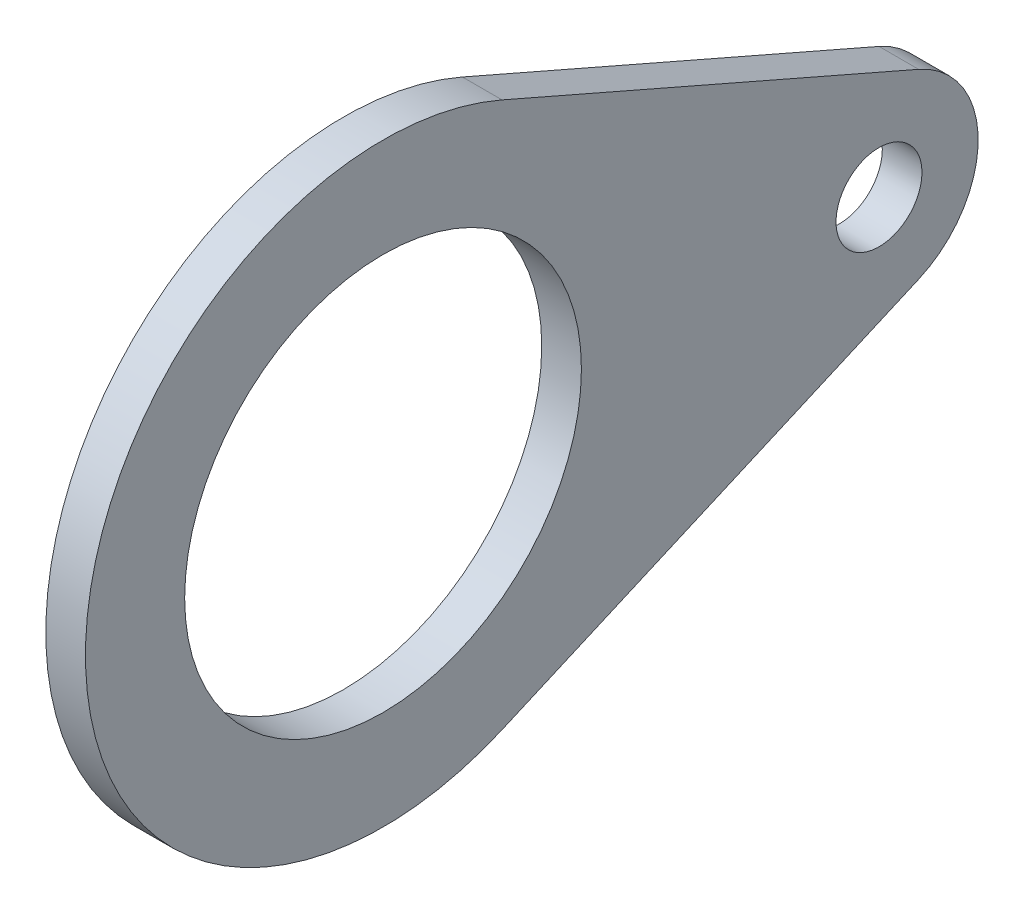
ISO-10303-21;
HEADER;
FILE_DESCRIPTION(('STEP AP214'),'2;1');
FILE_NAME('part.step','',(''),(''),'','','');
FILE_SCHEMA(('AUTOMOTIVE_DESIGN { 1 0 10303 214 1 1 1 1 }'));
ENDSEC;
DATA;
#1=APPLICATION_CONTEXT('core data for automotive mechanical design processes');
#2=APPLICATION_PROTOCOL_DEFINITION('international standard','automotive_design',2000,#1);
#3=PRODUCT_CONTEXT('',#1,'mechanical');
#4=PRODUCT('Part','Part','',(#3));
#5=PRODUCT_RELATED_PRODUCT_CATEGORY('part','',(#4));
#6=PRODUCT_DEFINITION_FORMATION('','',#4);
#7=PRODUCT_DEFINITION_CONTEXT('part definition',#1,'design');
#8=PRODUCT_DEFINITION('design','',#6,#7);
#9=PRODUCT_DEFINITION_SHAPE('','',#8);
#10=(LENGTH_UNIT() NAMED_UNIT(*) SI_UNIT(.MILLI.,.METRE.));
#11=(NAMED_UNIT(*) PLANE_ANGLE_UNIT() SI_UNIT($,.RADIAN.));
#12=(NAMED_UNIT(*) SI_UNIT($,.STERADIAN.) SOLID_ANGLE_UNIT());
#13=UNCERTAINTY_MEASURE_WITH_UNIT(LENGTH_MEASURE(1.E-05),#10,'distance_accuracy_value','');
#14=(GEOMETRIC_REPRESENTATION_CONTEXT(3) GLOBAL_UNCERTAINTY_ASSIGNED_CONTEXT((#13)) GLOBAL_UNIT_ASSIGNED_CONTEXT((#10,
#11,#12)) REPRESENTATION_CONTEXT('',''));
#15=CARTESIAN_POINT('',(0.,0.,0.));
#16=DIRECTION('',(0.,0.,1.));
#17=DIRECTION('',(1.,0.,0.));
#18=AXIS2_PLACEMENT_3D('',#15,#16,#17);
#19=CARTESIAN_POINT('',(6.00000000000001,0.,0.));
#20=DIRECTION('',(1.,0.,0.));
#21=DIRECTION('',(0.,0.,-1.));
#22=AXIS2_PLACEMENT_3D('',#19,#20,#21);
#23=PLANE('',#22);
#24=CARTESIAN_POINT('',(6.00000000000001,0.,0.));
#25=DIRECTION('',(1.,0.,0.));
#26=DIRECTION('',(0.,0.,-1.));
#27=AXIS2_PLACEMENT_3D('',#24,#25,#26);
#28=CIRCLE('',#27,30.);
#29=CARTESIAN_POINT('',(6.00000000000001,0.,-30.));
#30=VERTEX_POINT('',#29);
#31=EDGE_CURVE('E99',#30,#30,#28,.T.);
#32=ORIENTED_EDGE('',*,*,#31,.F.);
#33=EDGE_LOOP('',(#32));
#34=FACE_BOUND('',#33,.T.);
#35=CARTESIAN_POINT('',(6.00000000000001,0.,0.));
#36=DIRECTION('',(1.,0.,0.));
#37=DIRECTION('',(0.,0.,-1.));
#38=AXIS2_PLACEMENT_3D('',#35,#36,#37);
#39=CIRCLE('',#38,45.);
#40=CARTESIAN_POINT('',(6.00000000000001,41.2431812546025,-18.));
#41=VERTEX_POINT('',#40);
#42=CARTESIAN_POINT('',(6.00000000000001,-41.2431812546025,-18.));
#43=VERTEX_POINT('',#42);
#44=EDGE_CURVE('E84',#41,#43,#39,.T.);
#45=ORIENTED_EDGE('',*,*,#44,.T.);
#46=DIRECTION('',(0.,0.4,-0.916515138991168));
#47=VECTOR('',#46,1.);
#48=CARTESIAN_POINT('',(6.00000000000001,-41.2431812546025,-18.));
#49=LINE('',#48,#47);
#50=CARTESIAN_POINT('',(6.00000000000001,-13.7477270848675,-81.));
#51=VERTEX_POINT('',#50);
#52=EDGE_CURVE('E79',#43,#51,#49,.T.);
#53=ORIENTED_EDGE('',*,*,#52,.T.);
#54=CARTESIAN_POINT('',(6.00000000000001,5.55111512312578E-13,-75.));
#55=DIRECTION('',(1.,0.,0.));
#56=DIRECTION('',(0.,0.,-1.));
#57=AXIS2_PLACEMENT_3D('',#54,#55,#56);
#58=CIRCLE('',#57,15.);
#59=CARTESIAN_POINT('',(6.00000000000001,13.7477270848675,-81.));
#60=VERTEX_POINT('',#59);
#61=EDGE_CURVE('E82',#51,#60,#58,.T.);
#62=ORIENTED_EDGE('',*,*,#61,.T.);
#63=DIRECTION('',(0.,0.4,0.916515138991168));
#64=VECTOR('',#63,1.);
#65=CARTESIAN_POINT('',(6.00000000000001,41.2431812546025,-18.));
#66=LINE('',#65,#64);
#67=EDGE_CURVE('E49',#60,#41,#66,.T.);
#68=ORIENTED_EDGE('',*,*,#67,.T.);
#69=EDGE_LOOP('',(#45,#53,#62,#68));
#70=FACE_BOUND('',#69,.T.);
#71=CARTESIAN_POINT('',(6.00000000000001,5.55111512312578E-13,-75.));
#72=DIRECTION('',(1.,0.,0.));
#73=DIRECTION('',(0.,0.,-1.));
#74=AXIS2_PLACEMENT_3D('',#71,#72,#73);
#75=CIRCLE('',#74,6.5);
#76=CARTESIAN_POINT('',(6.00000000000001,5.55111512312578E-13,-81.5));
#77=VERTEX_POINT('',#76);
#78=EDGE_CURVE('E114',#77,#77,#75,.T.);
#79=ORIENTED_EDGE('',*,*,#78,.F.);
#80=EDGE_LOOP('',(#79));
#81=FACE_BOUND('',#80,.T.);
#82=ADVANCED_FACE('F32',(#34,#70,#81),#23,.T.);
#83=CARTESIAN_POINT('',(0.,0.,0.));
#84=DIRECTION('',(1.,0.,0.));
#85=DIRECTION('',(0.,0.,-1.));
#86=AXIS2_PLACEMENT_3D('',#83,#84,#85);
#87=PLANE('',#86);
#88=CARTESIAN_POINT('',(0.,0.,0.));
#89=DIRECTION('',(1.,0.,0.));
#90=DIRECTION('',(0.,0.,-1.));
#91=AXIS2_PLACEMENT_3D('',#88,#89,#90);
#92=CIRCLE('',#91,45.);
#93=CARTESIAN_POINT('',(0.,41.2431812546025,-18.));
#94=VERTEX_POINT('',#93);
#95=CARTESIAN_POINT('',(0.,-41.2431812546025,-18.));
#96=VERTEX_POINT('',#95);
#97=EDGE_CURVE('E96',#94,#96,#92,.T.);
#98=ORIENTED_EDGE('',*,*,#97,.F.);
#99=DIRECTION('',(0.,0.4,0.916515138991168));
#100=VECTOR('',#99,1.);
#101=CARTESIAN_POINT('',(0.,41.2431812546025,-18.));
#102=LINE('',#101,#100);
#103=CARTESIAN_POINT('',(0.,13.7477270848675,-81.));
#104=VERTEX_POINT('',#103);
#105=EDGE_CURVE('E72',#104,#94,#102,.T.);
#106=ORIENTED_EDGE('',*,*,#105,.F.);
#107=CARTESIAN_POINT('',(0.,5.55111512312578E-13,-75.));
#108=DIRECTION('',(1.,0.,0.));
#109=DIRECTION('',(0.,0.,-1.));
#110=AXIS2_PLACEMENT_3D('',#107,#108,#109);
#111=CIRCLE('',#110,15.);
#112=CARTESIAN_POINT('',(0.,-13.7477270848675,-81.));
#113=VERTEX_POINT('',#112);
#114=EDGE_CURVE('E66',#113,#104,#111,.T.);
#115=ORIENTED_EDGE('',*,*,#114,.F.);
#116=DIRECTION('',(0.,0.4,-0.916515138991168));
#117=VECTOR('',#116,1.);
#118=CARTESIAN_POINT('',(0.,-41.2431812546025,-18.));
#119=LINE('',#118,#117);
#120=EDGE_CURVE('E88',#96,#113,#119,.T.);
#121=ORIENTED_EDGE('',*,*,#120,.F.);
#122=EDGE_LOOP('',(#98,#106,#115,#121));
#123=FACE_BOUND('',#122,.T.);
#124=CARTESIAN_POINT('',(0.,0.,0.));
#125=DIRECTION('',(1.,0.,0.));
#126=DIRECTION('',(0.,0.,-1.));
#127=AXIS2_PLACEMENT_3D('',#124,#125,#126);
#128=CIRCLE('',#127,30.);
#129=CARTESIAN_POINT('',(0.,0.,-30.));
#130=VERTEX_POINT('',#129);
#131=EDGE_CURVE('E111',#130,#130,#128,.T.);
#132=ORIENTED_EDGE('',*,*,#131,.T.);
#133=EDGE_LOOP('',(#132));
#134=FACE_BOUND('',#133,.T.);
#135=CARTESIAN_POINT('',(0.,5.55111512312578E-13,-75.));
#136=DIRECTION('',(1.,0.,0.));
#137=DIRECTION('',(0.,0.,-1.));
#138=AXIS2_PLACEMENT_3D('',#135,#136,#137);
#139=CIRCLE('',#138,6.5);
#140=CARTESIAN_POINT('',(0.,5.55111512312578E-13,-81.5));
#141=VERTEX_POINT('',#140);
#142=EDGE_CURVE('E117',#141,#141,#139,.T.);
#143=ORIENTED_EDGE('',*,*,#142,.T.);
#144=EDGE_LOOP('',(#143));
#145=FACE_BOUND('',#144,.T.);
#146=ADVANCED_FACE('F107',(#123,#134,#145),#87,.F.);
#147=CARTESIAN_POINT('',(6.00000000000001,0.,0.));
#148=DIRECTION('',(-1.,0.,0.));
#149=DIRECTION('',(0.,0.,1.));
#150=AXIS2_PLACEMENT_3D('',#147,#148,#149);
#151=CYLINDRICAL_SURFACE('',#150,45.);
#152=ORIENTED_EDGE('',*,*,#97,.T.);
#153=DIRECTION('',(-1.,0.,0.));
#154=VECTOR('',#153,1.);
#155=CARTESIAN_POINT('',(6.00000000000001,-41.2431812546025,-18.));
#156=LINE('',#155,#154);
#157=EDGE_CURVE('E11',#43,#96,#156,.T.);
#158=ORIENTED_EDGE('',*,*,#157,.F.);
#159=ORIENTED_EDGE('',*,*,#44,.F.);
#160=DIRECTION('',(-1.,0.,0.));
#161=VECTOR('',#160,1.);
#162=CARTESIAN_POINT('',(6.00000000000001,41.2431812546025,-18.));
#163=LINE('',#162,#161);
#164=EDGE_CURVE('E92',#41,#94,#163,.T.);
#165=ORIENTED_EDGE('',*,*,#164,.T.);
#166=EDGE_LOOP('',(#152,#158,#159,#165));
#167=FACE_BOUND('',#166,.T.);
#168=ADVANCED_FACE('F34',(#167),#151,.T.);
#169=CARTESIAN_POINT('',(6.00000000000001,-41.2431812546025,-18.));
#170=DIRECTION('',(0.,0.916515138991168,0.4));
#171=DIRECTION('',(0.,-0.4,0.916515138991168));
#172=AXIS2_PLACEMENT_3D('',#169,#170,#171);
#173=PLANE('',#172);
#174=ORIENTED_EDGE('',*,*,#120,.T.);
#175=DIRECTION('',(-1.,0.,0.));
#176=VECTOR('',#175,1.);
#177=CARTESIAN_POINT('',(6.00000000000001,-13.7477270848675,-81.));
#178=LINE('',#177,#176);
#179=EDGE_CURVE('E41',#51,#113,#178,.T.);
#180=ORIENTED_EDGE('',*,*,#179,.F.);
#181=ORIENTED_EDGE('',*,*,#52,.F.);
#182=ORIENTED_EDGE('',*,*,#157,.T.);
#183=EDGE_LOOP('',(#174,#180,#181,#182));
#184=FACE_BOUND('',#183,.T.);
#185=ADVANCED_FACE('F87',(#184),#173,.F.);
#186=CARTESIAN_POINT('',(6.00000000000001,5.55111512312578E-13,-75.));
#187=DIRECTION('',(-1.,0.,0.));
#188=DIRECTION('',(0.,0.,1.));
#189=AXIS2_PLACEMENT_3D('',#186,#187,#188);
#190=CYLINDRICAL_SURFACE('',#189,15.);
#191=ORIENTED_EDGE('',*,*,#114,.T.);
#192=DIRECTION('',(-1.,0.,0.));
#193=VECTOR('',#192,1.);
#194=CARTESIAN_POINT('',(6.00000000000001,13.7477270848675,-81.));
#195=LINE('',#194,#193);
#196=EDGE_CURVE('E89',#60,#104,#195,.T.);
#197=ORIENTED_EDGE('',*,*,#196,.F.);
#198=ORIENTED_EDGE('',*,*,#61,.F.);
#199=ORIENTED_EDGE('',*,*,#179,.T.);
#200=EDGE_LOOP('',(#191,#197,#198,#199));
#201=FACE_BOUND('',#200,.T.);
#202=ADVANCED_FACE('F90',(#201),#190,.T.);
#203=CARTESIAN_POINT('',(6.00000000000001,41.2431812546025,-18.));
#204=DIRECTION('',(0.,-0.916515138991168,0.4));
#205=DIRECTION('',(0.,-0.4,-0.916515138991168));
#206=AXIS2_PLACEMENT_3D('',#203,#204,#205);
#207=PLANE('',#206);
#208=ORIENTED_EDGE('',*,*,#105,.T.);
#209=ORIENTED_EDGE('',*,*,#164,.F.);
#210=ORIENTED_EDGE('',*,*,#67,.F.);
#211=ORIENTED_EDGE('',*,*,#196,.T.);
#212=EDGE_LOOP('',(#208,#209,#210,#211));
#213=FACE_BOUND('',#212,.T.);
#214=ADVANCED_FACE('F104',(#213),#207,.F.);
#215=CARTESIAN_POINT('',(6.00000000000001,0.,0.));
#216=DIRECTION('',(-1.,0.,0.));
#217=DIRECTION('',(0.,0.,1.));
#218=AXIS2_PLACEMENT_3D('',#215,#216,#217);
#219=CYLINDRICAL_SURFACE('',#218,30.);
#220=ORIENTED_EDGE('',*,*,#31,.T.);
#221=EDGE_LOOP('',(#220));
#222=FACE_BOUND('',#221,.T.);
#223=ORIENTED_EDGE('',*,*,#131,.F.);
#224=EDGE_LOOP('',(#223));
#225=FACE_BOUND('',#224,.T.);
#226=ADVANCED_FACE('F134',(#222,#225),#219,.F.);
#227=CARTESIAN_POINT('',(6.00000000000001,5.55111512312578E-13,-75.));
#228=DIRECTION('',(-1.,0.,0.));
#229=DIRECTION('',(0.,0.,1.));
#230=AXIS2_PLACEMENT_3D('',#227,#228,#229);
#231=CYLINDRICAL_SURFACE('',#230,6.5);
#232=ORIENTED_EDGE('',*,*,#78,.T.);
#233=EDGE_LOOP('',(#232));
#234=FACE_BOUND('',#233,.T.);
#235=ORIENTED_EDGE('',*,*,#142,.F.);
#236=EDGE_LOOP('',(#235));
#237=FACE_BOUND('',#236,.T.);
#238=ADVANCED_FACE('F123',(#234,#237),#231,.F.);
#239=CLOSED_SHELL('',(#82,#146,#168,#185,#202,#214,#226,#238));
#240=MANIFOLD_SOLID_BREP('B2',#239);
#241=ADVANCED_BREP_SHAPE_REPRESENTATION('',(#18,#240),#14);
#242=SHAPE_DEFINITION_REPRESENTATION(#9,#241);
ENDSEC;
END-ISO-10303-21;
